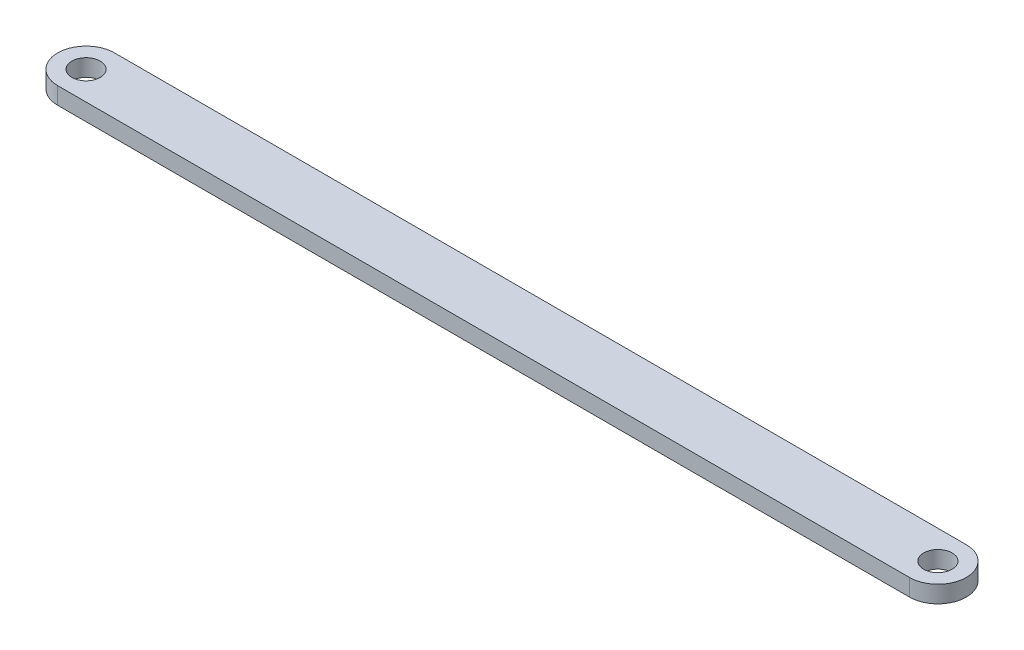
ISO-10303-21;
HEADER;
FILE_DESCRIPTION(('STEP AP214'),'2;1');
FILE_NAME('part.step','',(''),(''),'','','');
FILE_SCHEMA(('AUTOMOTIVE_DESIGN { 1 0 10303 214 1 1 1 1 }'));
ENDSEC;
DATA;
#1=APPLICATION_CONTEXT('core data for automotive mechanical design processes');
#2=APPLICATION_PROTOCOL_DEFINITION('international standard','automotive_design',2000,#1);
#3=PRODUCT_CONTEXT('',#1,'mechanical');
#4=PRODUCT('Part','Part','',(#3));
#5=PRODUCT_RELATED_PRODUCT_CATEGORY('part','',(#4));
#6=PRODUCT_DEFINITION_FORMATION('','',#4);
#7=PRODUCT_DEFINITION_CONTEXT('part definition',#1,'design');
#8=PRODUCT_DEFINITION('design','',#6,#7);
#9=PRODUCT_DEFINITION_SHAPE('','',#8);
#10=(LENGTH_UNIT() NAMED_UNIT(*) SI_UNIT(.MILLI.,.METRE.));
#11=(NAMED_UNIT(*) PLANE_ANGLE_UNIT() SI_UNIT($,.RADIAN.));
#12=(NAMED_UNIT(*) SI_UNIT($,.STERADIAN.) SOLID_ANGLE_UNIT());
#13=UNCERTAINTY_MEASURE_WITH_UNIT(LENGTH_MEASURE(1.E-05),#10,'distance_accuracy_value','');
#14=(GEOMETRIC_REPRESENTATION_CONTEXT(3) GLOBAL_UNCERTAINTY_ASSIGNED_CONTEXT((#13)) GLOBAL_UNIT_ASSIGNED_CONTEXT((#10,
#11,#12)) REPRESENTATION_CONTEXT('',''));
#15=CARTESIAN_POINT('',(0.,0.,0.));
#16=DIRECTION('',(0.,0.,1.));
#17=DIRECTION('',(1.,0.,0.));
#18=AXIS2_PLACEMENT_3D('',#15,#16,#17);
#19=CARTESIAN_POINT('',(0.,3.,0.));
#20=DIRECTION('',(0.,1.,0.));
#21=DIRECTION('',(0.,0.,1.));
#22=AXIS2_PLACEMENT_3D('',#19,#20,#21);
#23=PLANE('',#22);
#24=CARTESIAN_POINT('',(0.,3.,0.));
#25=DIRECTION('',(0.,1.,0.));
#26=DIRECTION('',(0.,0.,1.));
#27=AXIS2_PLACEMENT_3D('',#24,#25,#26);
#28=CIRCLE('',#27,2.5);
#29=CARTESIAN_POINT('',(0.,3.,2.5));
#30=VERTEX_POINT('',#29);
#31=EDGE_CURVE('E112',#30,#30,#28,.T.);
#32=ORIENTED_EDGE('',*,*,#31,.F.);
#33=EDGE_LOOP('',(#32));
#34=FACE_BOUND('',#33,.T.);
#35=CARTESIAN_POINT('',(0.,3.,0.));
#36=DIRECTION('',(0.,1.,0.));
#37=DIRECTION('',(0.,0.,1.));
#38=AXIS2_PLACEMENT_3D('',#35,#36,#37);
#39=CIRCLE('',#38,5.);
#40=CARTESIAN_POINT('',(0.,3.,-5.));
#41=VERTEX_POINT('',#40);
#42=CARTESIAN_POINT('',(0.,3.,5.));
#43=VERTEX_POINT('',#42);
#44=EDGE_CURVE('E92',#41,#43,#39,.T.);
#45=ORIENTED_EDGE('',*,*,#44,.T.);
#46=DIRECTION('',(1.,0.,0.));
#47=VECTOR('',#46,1.);
#48=CARTESIAN_POINT('',(0.,3.,5.));
#49=LINE('',#48,#47);
#50=CARTESIAN_POINT('',(150.,3.,5.));
#51=VERTEX_POINT('',#50);
#52=EDGE_CURVE('E87',#43,#51,#49,.T.);
#53=ORIENTED_EDGE('',*,*,#52,.T.);
#54=CARTESIAN_POINT('',(150.,3.,0.));
#55=DIRECTION('',(0.,1.,0.));
#56=DIRECTION('',(0.,0.,1.));
#57=AXIS2_PLACEMENT_3D('',#54,#55,#56);
#58=CIRCLE('',#57,5.);
#59=CARTESIAN_POINT('',(150.,3.,-5.));
#60=VERTEX_POINT('',#59);
#61=EDGE_CURVE('E90',#51,#60,#58,.T.);
#62=ORIENTED_EDGE('',*,*,#61,.T.);
#63=DIRECTION('',(-1.,0.,0.));
#64=VECTOR('',#63,1.);
#65=CARTESIAN_POINT('',(0.,3.,-5.));
#66=LINE('',#65,#64);
#67=EDGE_CURVE('E57',#60,#41,#66,.T.);
#68=ORIENTED_EDGE('',*,*,#67,.T.);
#69=EDGE_LOOP('',(#45,#53,#62,#68));
#70=FACE_BOUND('',#69,.T.);
#71=CARTESIAN_POINT('',(150.,3.,0.));
#72=DIRECTION('',(0.,1.,0.));
#73=DIRECTION('',(0.,0.,1.));
#74=AXIS2_PLACEMENT_3D('',#71,#72,#73);
#75=CIRCLE('',#74,2.5);
#76=CARTESIAN_POINT('',(150.,3.,2.5));
#77=VERTEX_POINT('',#76);
#78=EDGE_CURVE('E134',#77,#77,#75,.T.);
#79=ORIENTED_EDGE('',*,*,#78,.F.);
#80=EDGE_LOOP('',(#79));
#81=FACE_BOUND('',#80,.T.);
#82=ADVANCED_FACE('F39',(#34,#70,#81),#23,.T.);
#83=CARTESIAN_POINT('',(0.,0.,0.));
#84=DIRECTION('',(0.,1.,0.));
#85=DIRECTION('',(0.,0.,1.));
#86=AXIS2_PLACEMENT_3D('',#83,#84,#85);
#87=PLANE('',#86);
#88=CARTESIAN_POINT('',(0.,0.,0.));
#89=DIRECTION('',(0.,1.,0.));
#90=DIRECTION('',(0.,0.,1.));
#91=AXIS2_PLACEMENT_3D('',#88,#89,#90);
#92=CIRCLE('',#91,5.);
#93=CARTESIAN_POINT('',(0.,0.,-5.));
#94=VERTEX_POINT('',#93);
#95=CARTESIAN_POINT('',(0.,0.,5.));
#96=VERTEX_POINT('',#95);
#97=EDGE_CURVE('E108',#94,#96,#92,.T.);
#98=ORIENTED_EDGE('',*,*,#97,.F.);
#99=DIRECTION('',(-1.,0.,0.));
#100=VECTOR('',#99,1.);
#101=CARTESIAN_POINT('',(0.,0.,-5.));
#102=LINE('',#101,#100);
#103=CARTESIAN_POINT('',(150.,0.,-5.));
#104=VERTEX_POINT('',#103);
#105=EDGE_CURVE('E80',#104,#94,#102,.T.);
#106=ORIENTED_EDGE('',*,*,#105,.F.);
#107=CARTESIAN_POINT('',(150.,0.,0.));
#108=DIRECTION('',(0.,1.,0.));
#109=DIRECTION('',(0.,0.,1.));
#110=AXIS2_PLACEMENT_3D('',#107,#108,#109);
#111=CIRCLE('',#110,5.);
#112=CARTESIAN_POINT('',(150.,0.,5.));
#113=VERTEX_POINT('',#112);
#114=EDGE_CURVE('E74',#113,#104,#111,.T.);
#115=ORIENTED_EDGE('',*,*,#114,.F.);
#116=DIRECTION('',(1.,0.,0.));
#117=VECTOR('',#116,1.);
#118=CARTESIAN_POINT('',(0.,0.,5.));
#119=LINE('',#118,#117);
#120=EDGE_CURVE('E97',#96,#113,#119,.T.);
#121=ORIENTED_EDGE('',*,*,#120,.F.);
#122=EDGE_LOOP('',(#98,#106,#115,#121));
#123=FACE_BOUND('',#122,.T.);
#124=CARTESIAN_POINT('',(0.,0.,0.));
#125=DIRECTION('',(0.,1.,0.));
#126=DIRECTION('',(0.,0.,1.));
#127=AXIS2_PLACEMENT_3D('',#124,#125,#126);
#128=CIRCLE('',#127,2.5);
#129=CARTESIAN_POINT('',(0.,0.,2.5));
#130=VERTEX_POINT('',#129);
#131=EDGE_CURVE('E130',#130,#130,#128,.T.);
#132=ORIENTED_EDGE('',*,*,#131,.T.);
#133=EDGE_LOOP('',(#132));
#134=FACE_BOUND('',#133,.T.);
#135=CARTESIAN_POINT('',(150.,0.,0.));
#136=DIRECTION('',(0.,1.,0.));
#137=DIRECTION('',(0.,0.,1.));
#138=AXIS2_PLACEMENT_3D('',#135,#136,#137);
#139=CIRCLE('',#138,2.5);
#140=CARTESIAN_POINT('',(150.,0.,2.5));
#141=VERTEX_POINT('',#140);
#142=EDGE_CURVE('E138',#141,#141,#139,.T.);
#143=ORIENTED_EDGE('',*,*,#142,.T.);
#144=EDGE_LOOP('',(#143));
#145=FACE_BOUND('',#144,.T.);
#146=ADVANCED_FACE('F125',(#123,#134,#145),#87,.F.);
#147=CARTESIAN_POINT('',(0.,3.,0.));
#148=DIRECTION('',(0.,-1.,0.));
#149=DIRECTION('',(0.,0.,-1.));
#150=AXIS2_PLACEMENT_3D('',#147,#148,#149);
#151=CYLINDRICAL_SURFACE('',#150,5.);
#152=ORIENTED_EDGE('',*,*,#97,.T.);
#153=DIRECTION('',(0.,-1.,0.));
#154=VECTOR('',#153,1.);
#155=CARTESIAN_POINT('',(0.,3.,5.));
#156=LINE('',#155,#154);
#157=EDGE_CURVE('E11',#43,#96,#156,.T.);
#158=ORIENTED_EDGE('',*,*,#157,.F.);
#159=ORIENTED_EDGE('',*,*,#44,.F.);
#160=DIRECTION('',(0.,-1.,0.));
#161=VECTOR('',#160,1.);
#162=CARTESIAN_POINT('',(0.,3.,-5.));
#163=LINE('',#162,#161);
#164=EDGE_CURVE('E104',#41,#94,#163,.T.);
#165=ORIENTED_EDGE('',*,*,#164,.T.);
#166=EDGE_LOOP('',(#152,#158,#159,#165));
#167=FACE_BOUND('',#166,.T.);
#168=ADVANCED_FACE('F41',(#167),#151,.T.);
#169=CARTESIAN_POINT('',(0.,3.,5.));
#170=DIRECTION('',(0.,0.,-1.));
#171=DIRECTION('',(-1.,0.,0.));
#172=AXIS2_PLACEMENT_3D('',#169,#170,#171);
#173=PLANE('',#172);
#174=ORIENTED_EDGE('',*,*,#120,.T.);
#175=DIRECTION('',(0.,-1.,0.));
#176=VECTOR('',#175,1.);
#177=CARTESIAN_POINT('',(150.,3.,5.));
#178=LINE('',#177,#176);
#179=EDGE_CURVE('E49',#51,#113,#178,.T.);
#180=ORIENTED_EDGE('',*,*,#179,.F.);
#181=ORIENTED_EDGE('',*,*,#52,.F.);
#182=ORIENTED_EDGE('',*,*,#157,.T.);
#183=EDGE_LOOP('',(#174,#180,#181,#182));
#184=FACE_BOUND('',#183,.T.);
#185=ADVANCED_FACE('F96',(#184),#173,.F.);
#186=CARTESIAN_POINT('',(150.,3.,0.));
#187=DIRECTION('',(0.,-1.,0.));
#188=DIRECTION('',(0.,0.,-1.));
#189=AXIS2_PLACEMENT_3D('',#186,#187,#188);
#190=CYLINDRICAL_SURFACE('',#189,5.);
#191=ORIENTED_EDGE('',*,*,#114,.T.);
#192=DIRECTION('',(0.,-1.,0.));
#193=VECTOR('',#192,1.);
#194=CARTESIAN_POINT('',(150.,3.,-5.));
#195=LINE('',#194,#193);
#196=EDGE_CURVE('E99',#60,#104,#195,.T.);
#197=ORIENTED_EDGE('',*,*,#196,.F.);
#198=ORIENTED_EDGE('',*,*,#61,.F.);
#199=ORIENTED_EDGE('',*,*,#179,.T.);
#200=EDGE_LOOP('',(#191,#197,#198,#199));
#201=FACE_BOUND('',#200,.T.);
#202=ADVANCED_FACE('F100',(#201),#190,.T.);
#203=CARTESIAN_POINT('',(0.,3.,-5.));
#204=DIRECTION('',(0.,0.,1.));
#205=DIRECTION('',(1.,0.,0.));
#206=AXIS2_PLACEMENT_3D('',#203,#204,#205);
#207=PLANE('',#206);
#208=ORIENTED_EDGE('',*,*,#105,.T.);
#209=ORIENTED_EDGE('',*,*,#164,.F.);
#210=ORIENTED_EDGE('',*,*,#67,.F.);
#211=ORIENTED_EDGE('',*,*,#196,.T.);
#212=EDGE_LOOP('',(#208,#209,#210,#211));
#213=FACE_BOUND('',#212,.T.);
#214=ADVANCED_FACE('F122',(#213),#207,.F.);
#215=CARTESIAN_POINT('',(0.,3.,0.));
#216=DIRECTION('',(0.,-1.,0.));
#217=DIRECTION('',(0.,0.,-1.));
#218=AXIS2_PLACEMENT_3D('',#215,#216,#217);
#219=CYLINDRICAL_SURFACE('',#218,2.5);
#220=ORIENTED_EDGE('',*,*,#31,.T.);
#221=EDGE_LOOP('',(#220));
#222=FACE_BOUND('',#221,.T.);
#223=ORIENTED_EDGE('',*,*,#131,.F.);
#224=EDGE_LOOP('',(#223));
#225=FACE_BOUND('',#224,.T.);
#226=ADVANCED_FACE('F157',(#222,#225),#219,.F.);
#227=CARTESIAN_POINT('',(150.,3.,0.));
#228=DIRECTION('',(0.,-1.,0.));
#229=DIRECTION('',(0.,0.,-1.));
#230=AXIS2_PLACEMENT_3D('',#227,#228,#229);
#231=CYLINDRICAL_SURFACE('',#230,2.5);
#232=ORIENTED_EDGE('',*,*,#78,.T.);
#233=EDGE_LOOP('',(#232));
#234=FACE_BOUND('',#233,.T.);
#235=ORIENTED_EDGE('',*,*,#142,.F.);
#236=EDGE_LOOP('',(#235));
#237=FACE_BOUND('',#236,.T.);
#238=ADVANCED_FACE('F146',(#234,#237),#231,.F.);
#239=CLOSED_SHELL('',(#82,#146,#168,#185,#202,#214,#226,#238));
#240=MANIFOLD_SOLID_BREP('B2',#239);
#241=ADVANCED_BREP_SHAPE_REPRESENTATION('',(#18,#240),#14);
#242=SHAPE_DEFINITION_REPRESENTATION(#9,#241);
ENDSEC;
END-ISO-10303-21;
